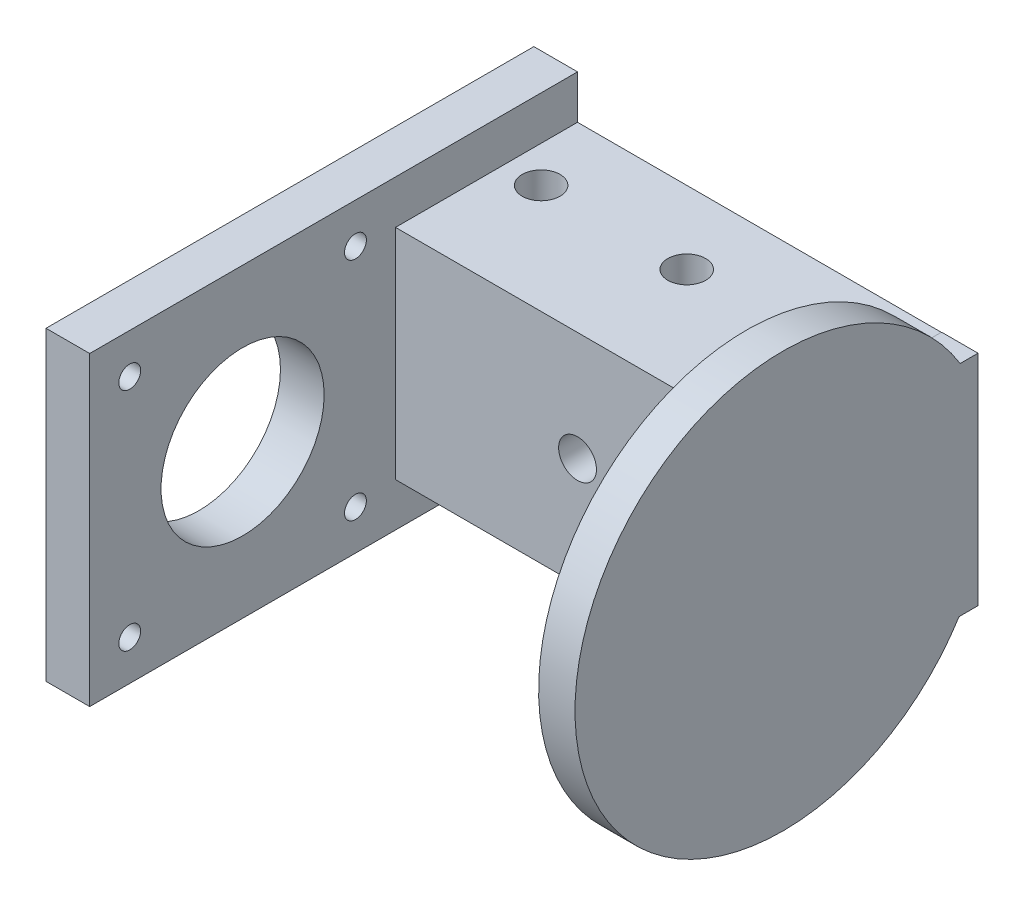
ISO-10303-21;
HEADER;
FILE_DESCRIPTION(('STEP AP214'),'2;1');
FILE_NAME('part.step','',(''),(''),'','','');
FILE_SCHEMA(('AUTOMOTIVE_DESIGN { 1 0 10303 214 1 1 1 1 }'));
ENDSEC;
DATA;
#1=APPLICATION_CONTEXT('core data for automotive mechanical design processes');
#2=APPLICATION_PROTOCOL_DEFINITION('international standard','automotive_design',2000,#1);
#3=PRODUCT_CONTEXT('',#1,'mechanical');
#4=PRODUCT('Part','Part','',(#3));
#5=PRODUCT_RELATED_PRODUCT_CATEGORY('part','',(#4));
#6=PRODUCT_DEFINITION_FORMATION('','',#4);
#7=PRODUCT_DEFINITION_CONTEXT('part definition',#1,'design');
#8=PRODUCT_DEFINITION('design','',#6,#7);
#9=PRODUCT_DEFINITION_SHAPE('','',#8);
#10=(LENGTH_UNIT() NAMED_UNIT(*) SI_UNIT(.MILLI.,.METRE.));
#11=(NAMED_UNIT(*) PLANE_ANGLE_UNIT() SI_UNIT($,.RADIAN.));
#12=(NAMED_UNIT(*) SI_UNIT($,.STERADIAN.) SOLID_ANGLE_UNIT());
#13=UNCERTAINTY_MEASURE_WITH_UNIT(LENGTH_MEASURE(1.E-05),#10,'distance_accuracy_value','');
#14=(GEOMETRIC_REPRESENTATION_CONTEXT(3) GLOBAL_UNCERTAINTY_ASSIGNED_CONTEXT((#13)) GLOBAL_UNIT_ASSIGNED_CONTEXT((#10,
#11,#12)) REPRESENTATION_CONTEXT('',''));
#15=CARTESIAN_POINT('',(0.,0.,0.));
#16=DIRECTION('',(0.,0.,1.));
#17=DIRECTION('',(1.,0.,0.));
#18=AXIS2_PLACEMENT_3D('',#15,#16,#17);
#19=CARTESIAN_POINT('',(39.0280559659004,41.9999994337559,47.0000004470348));
#20=DIRECTION('',(0.,0.,1.));
#21=DIRECTION('',(0.,-1.,0.));
#22=AXIS2_PLACEMENT_3D('',#19,#20,#21);
#23=PLANE('',#22);
#24=DIRECTION('',(0.,-1.,0.));
#25=VECTOR('',#24,1.);
#26=CARTESIAN_POINT('',(45.0280569493771,41.9999994337559,47.0000004470348));
#27=LINE('',#26,#25);
#28=CARTESIAN_POINT('',(45.0280569493771,41.9999994337559,47.0000004470348));
#29=VERTEX_POINT('',#28);
#30=CARTESIAN_POINT('',(45.0280569493771,0.,47.0000004470348));
#31=VERTEX_POINT('',#30);
#32=EDGE_CURVE('E198',#29,#31,#27,.T.);
#33=ORIENTED_EDGE('',*,*,#32,.F.);
#34=DIRECTION('',(1.,0.,0.));
#35=VECTOR('',#34,1.);
#36=CARTESIAN_POINT('',(39.0280559659004,41.9999994337559,47.0000004470348));
#37=LINE('',#36,#35);
#38=CARTESIAN_POINT('',(39.0280559659004,41.9999994337559,47.0000004470348));
#39=VERTEX_POINT('',#38);
#40=EDGE_CURVE('E11',#39,#29,#37,.T.);
#41=ORIENTED_EDGE('',*,*,#40,.F.);
#42=DIRECTION('',(0.,-1.,0.));
#43=VECTOR('',#42,1.);
#44=CARTESIAN_POINT('',(39.0280559659004,41.9999994337559,47.0000004470348));
#45=LINE('',#44,#43);
#46=CARTESIAN_POINT('',(39.0280559659004,0.,47.0000004470348));
#47=VERTEX_POINT('',#46);
#48=EDGE_CURVE('E199',#39,#47,#45,.T.);
#49=ORIENTED_EDGE('',*,*,#48,.T.);
#50=DIRECTION('',(1.,0.,0.));
#51=VECTOR('',#50,1.);
#52=CARTESIAN_POINT('',(39.0280559659004,0.,47.0000004470348));
#53=LINE('',#52,#51);
#54=EDGE_CURVE('E213',#47,#31,#53,.T.);
#55=ORIENTED_EDGE('',*,*,#54,.T.);
#56=EDGE_LOOP('',(#33,#41,#49,#55));
#57=FACE_BOUND('',#56,.T.);
#58=ADVANCED_FACE('F39',(#57),#23,.T.);
#59=CARTESIAN_POINT('',(39.0280559659004,41.9999994337559,-19.9999995529652));
#60=DIRECTION('',(0.,1.,0.));
#61=DIRECTION('',(0.,0.,1.));
#62=AXIS2_PLACEMENT_3D('',#59,#60,#61);
#63=PLANE('',#62);
#64=DIRECTION('',(0.,0.,1.));
#65=VECTOR('',#64,1.);
#66=CARTESIAN_POINT('',(45.0280569493771,41.9999994337559,-19.9999995529652));
#67=LINE('',#66,#65);
#68=CARTESIAN_POINT('',(45.0280569493771,41.9999994337559,-19.9999995529652));
#69=VERTEX_POINT('',#68);
#70=EDGE_CURVE('E203',#69,#29,#67,.T.);
#71=ORIENTED_EDGE('',*,*,#70,.F.);
#72=DIRECTION('',(1.,0.,0.));
#73=VECTOR('',#72,1.);
#74=CARTESIAN_POINT('',(39.0280559659004,41.9999994337559,-19.9999995529652));
#75=LINE('',#74,#73);
#76=CARTESIAN_POINT('',(39.0280559659004,41.9999994337559,-19.9999995529652));
#77=VERTEX_POINT('',#76);
#78=EDGE_CURVE('E47',#77,#69,#75,.T.);
#79=ORIENTED_EDGE('',*,*,#78,.F.);
#80=DIRECTION('',(0.,0.,1.));
#81=VECTOR('',#80,1.);
#82=CARTESIAN_POINT('',(39.0280559659004,41.9999994337559,-19.9999995529652));
#83=LINE('',#82,#81);
#84=EDGE_CURVE('E210',#77,#39,#83,.T.);
#85=ORIENTED_EDGE('',*,*,#84,.T.);
#86=ORIENTED_EDGE('',*,*,#40,.T.);
#87=EDGE_LOOP('',(#71,#79,#85,#86));
#88=FACE_BOUND('',#87,.T.);
#89=ADVANCED_FACE('F297',(#88),#63,.T.);
#90=CARTESIAN_POINT('',(39.0280559659004,0.,-19.9999995529652));
#91=DIRECTION('',(0.,0.,-1.));
#92=DIRECTION('',(0.,1.,0.));
#93=AXIS2_PLACEMENT_3D('',#90,#91,#92);
#94=PLANE('',#93);
#95=DIRECTION('',(-1.,0.,0.));
#96=VECTOR('',#95,1.);
#97=CARTESIAN_POINT('',(95.0280569493771,6.00000005215406,-19.9999995529652));
#98=LINE('',#97,#96);
#99=CARTESIAN_POINT('',(100.028056949377,6.00000005215406,-19.9999995529652));
#100=VERTEX_POINT('',#99);
#101=CARTESIAN_POINT('',(45.0280569493771,6.00000005215406,-19.9999995529652));
#102=VERTEX_POINT('',#101);
#103=EDGE_CURVE('E177',#100,#102,#98,.T.);
#104=ORIENTED_EDGE('',*,*,#103,.T.);
#105=DIRECTION('',(0.,1.,0.));
#106=VECTOR('',#105,1.);
#107=CARTESIAN_POINT('',(45.0280569493771,0.,-19.9999995529652));
#108=LINE('',#107,#106);
#109=CARTESIAN_POINT('',(45.0280569493771,0.,-19.9999995529652));
#110=VERTEX_POINT('',#109);
#111=EDGE_CURVE('E220',#110,#102,#108,.T.);
#112=ORIENTED_EDGE('',*,*,#111,.F.);
#113=DIRECTION('',(1.,0.,0.));
#114=VECTOR('',#113,1.);
#115=CARTESIAN_POINT('',(39.0280559659004,0.,-19.9999995529652));
#116=LINE('',#115,#114);
#117=CARTESIAN_POINT('',(39.0280559659004,0.,-19.9999995529652));
#118=VERTEX_POINT('',#117);
#119=EDGE_CURVE('E227',#118,#110,#116,.T.);
#120=ORIENTED_EDGE('',*,*,#119,.F.);
#121=DIRECTION('',(0.,1.,0.));
#122=VECTOR('',#121,1.);
#123=CARTESIAN_POINT('',(39.0280559659004,0.,-19.9999995529652));
#124=LINE('',#123,#122);
#125=CARTESIAN_POINT('',(39.0280559659004,10.9999999403954,-19.9999995529652));
#126=VERTEX_POINT('',#125);
#127=EDGE_CURVE('E207',#118,#126,#124,.T.);
#128=ORIENTED_EDGE('',*,*,#127,.T.);
#129=DIRECTION('',(-1.,0.,0.));
#130=VECTOR('',#129,1.);
#131=CARTESIAN_POINT('',(95.0280569493771,10.9999999403954,-19.9999995529652));
#132=LINE('',#131,#130);
#133=CARTESIAN_POINT('',(95.0280569493771,10.9999999403954,-19.9999995529652));
#134=VERTEX_POINT('',#133);
#135=EDGE_CURVE('E277',#134,#126,#132,.T.);
#136=ORIENTED_EDGE('',*,*,#135,.F.);
#137=DIRECTION('',(0.,1.,0.));
#138=VECTOR('',#137,1.);
#139=CARTESIAN_POINT('',(95.0280569493771,6.00000005215406,-19.9999995529652));
#140=LINE('',#139,#138);
#141=CARTESIAN_POINT('',(95.0280569493771,30.9999994933605,-19.9999995529652));
#142=VERTEX_POINT('',#141);
#143=EDGE_CURVE('E314',#134,#142,#140,.T.);
#144=ORIENTED_EDGE('',*,*,#143,.T.);
#145=DIRECTION('',(-1.,0.,0.));
#146=VECTOR('',#145,1.);
#147=CARTESIAN_POINT('',(95.0280569493771,30.9999994933605,-19.9999995529652));
#148=LINE('',#147,#146);
#149=CARTESIAN_POINT('',(39.0280559659004,30.9999994933605,-19.9999995529652));
#150=VERTEX_POINT('',#149);
#151=EDGE_CURVE('E266',#142,#150,#148,.T.);
#152=ORIENTED_EDGE('',*,*,#151,.T.);
#153=EDGE_CURVE('E206',#150,#77,#124,.T.);
#154=ORIENTED_EDGE('',*,*,#153,.T.);
#155=ORIENTED_EDGE('',*,*,#78,.T.);
#156=CARTESIAN_POINT('',(45.0280569493771,35.9999984502792,-19.9999995529652));
#157=VERTEX_POINT('',#156);
#158=EDGE_CURVE('E219',#157,#69,#108,.T.);
#159=ORIENTED_EDGE('',*,*,#158,.F.);
#160=DIRECTION('',(-1.,0.,0.));
#161=VECTOR('',#160,1.);
#162=CARTESIAN_POINT('',(95.0280569493771,35.9999984502792,-19.9999995529652));
#163=LINE('',#162,#161);
#164=CARTESIAN_POINT('',(95.0280569493771,35.9999984502792,-19.9999995529652));
#165=VERTEX_POINT('',#164);
#166=EDGE_CURVE('E174',#165,#157,#163,.T.);
#167=ORIENTED_EDGE('',*,*,#166,.F.);
#168=CARTESIAN_POINT('',(95.0280569493771,36.0364722615263,-19.9999995529652));
#169=VERTEX_POINT('',#168);
#170=EDGE_CURVE('E280',#165,#169,#140,.T.);
#171=ORIENTED_EDGE('',*,*,#170,.T.);
#172=DIRECTION('',(1.,0.,0.));
#173=VECTOR('',#172,1.);
#174=CARTESIAN_POINT('',(95.0280569493771,36.0364722615263,-19.9999995529652));
#175=LINE('',#174,#173);
#176=CARTESIAN_POINT('',(100.028056949377,36.0364722615263,-19.9999995529652));
#177=VERTEX_POINT('',#176);
#178=EDGE_CURVE('E311',#169,#177,#175,.T.);
#179=ORIENTED_EDGE('',*,*,#178,.T.);
#180=DIRECTION('',(0.,-1.,0.));
#181=VECTOR('',#180,1.);
#182=CARTESIAN_POINT('',(100.028056949377,6.00000005215406,-19.9999995529652));
#183=LINE('',#182,#181);
#184=EDGE_CURVE('E308',#177,#100,#183,.T.);
#185=ORIENTED_EDGE('',*,*,#184,.T.);
#186=EDGE_LOOP('',(#104,#112,#120,#128,#136,#144,#152,#154,#155,#159,#167,#171,#179,#185));
#187=FACE_BOUND('',#186,.T.);
#188=ADVANCED_FACE('F291',(#187),#94,.T.);
#189=CARTESIAN_POINT('',(39.0280559659004,0.,47.0000004470348));
#190=DIRECTION('',(0.,-1.,0.));
#191=DIRECTION('',(0.,0.,-1.));
#192=AXIS2_PLACEMENT_3D('',#189,#190,#191);
#193=PLANE('',#192);
#194=DIRECTION('',(0.,0.,-1.));
#195=VECTOR('',#194,1.);
#196=CARTESIAN_POINT('',(45.0280569493771,0.,47.0000004470348));
#197=LINE('',#196,#195);
#198=EDGE_CURVE('E216',#31,#110,#197,.T.);
#199=ORIENTED_EDGE('',*,*,#198,.F.);
#200=ORIENTED_EDGE('',*,*,#54,.F.);
#201=DIRECTION('',(0.,0.,-1.));
#202=VECTOR('',#201,1.);
#203=CARTESIAN_POINT('',(39.0280559659004,0.,47.0000004470348));
#204=LINE('',#203,#202);
#205=EDGE_CURVE('E202',#47,#118,#204,.T.);
#206=ORIENTED_EDGE('',*,*,#205,.T.);
#207=ORIENTED_EDGE('',*,*,#119,.T.);
#208=EDGE_LOOP('',(#199,#200,#206,#207));
#209=FACE_BOUND('',#208,.T.);
#210=ADVANCED_FACE('F304',(#209),#193,.T.);
#211=CARTESIAN_POINT('',(39.0280559659004,0.,0.));
#212=DIRECTION('',(1.,0.,0.));
#213=DIRECTION('',(0.,0.,-1.));
#214=AXIS2_PLACEMENT_3D('',#211,#212,#213);
#215=PLANE('',#214);
#216=CARTESIAN_POINT('',(39.0280559659004,36.4999992512167,41.4999998882413));
#217=DIRECTION('',(1.,0.,0.));
#218=DIRECTION('',(0.,0.,-1.));
#219=AXIS2_PLACEMENT_3D('',#216,#217,#218);
#220=CIRCLE('',#219,1.5);
#221=CARTESIAN_POINT('',(39.0280559659004,36.4999992512167,39.9999998882413));
#222=VERTEX_POINT('',#221);
#223=EDGE_CURVE('E342',#222,#222,#220,.T.);
#224=ORIENTED_EDGE('',*,*,#223,.T.);
#225=EDGE_LOOP('',(#224));
#226=FACE_BOUND('',#225,.T.);
#227=CARTESIAN_POINT('',(39.0280559659004,5.49999925121665,41.4999998882413));
#228=DIRECTION('',(1.,0.,0.));
#229=DIRECTION('',(0.,0.,-1.));
#230=AXIS2_PLACEMENT_3D('',#227,#228,#229);
#231=CIRCLE('',#230,1.5);
#232=CARTESIAN_POINT('',(39.0280559659004,5.49999925121665,39.9999998882413));
#233=VERTEX_POINT('',#232);
#234=EDGE_CURVE('E336',#233,#233,#231,.T.);
#235=ORIENTED_EDGE('',*,*,#234,.T.);
#236=EDGE_LOOP('',(#235));
#237=FACE_BOUND('',#236,.T.);
#238=CARTESIAN_POINT('',(39.0280559659004,5.49999925121665,10.4999998882413));
#239=DIRECTION('',(1.,0.,0.));
#240=DIRECTION('',(0.,0.,-1.));
#241=AXIS2_PLACEMENT_3D('',#238,#239,#240);
#242=CIRCLE('',#241,1.5);
#243=CARTESIAN_POINT('',(39.0280559659004,5.49999925121665,8.99999988824129));
#244=VERTEX_POINT('',#243);
#245=EDGE_CURVE('E330',#244,#244,#242,.T.);
#246=ORIENTED_EDGE('',*,*,#245,.T.);
#247=EDGE_LOOP('',(#246));
#248=FACE_BOUND('',#247,.T.);
#249=CARTESIAN_POINT('',(39.0280559659004,36.4999992512167,10.4999998882413));
#250=DIRECTION('',(1.,0.,0.));
#251=DIRECTION('',(0.,0.,-1.));
#252=AXIS2_PLACEMENT_3D('',#249,#250,#251);
#253=CIRCLE('',#252,1.5);
#254=CARTESIAN_POINT('',(39.0280559659004,36.4999992512167,8.99999988824129));
#255=VERTEX_POINT('',#254);
#256=EDGE_CURVE('E345',#255,#255,#253,.T.);
#257=ORIENTED_EDGE('',*,*,#256,.T.);
#258=EDGE_LOOP('',(#257));
#259=FACE_BOUND('',#258,.T.);
#260=CARTESIAN_POINT('',(39.0280559659004,20.9999992512167,25.9999998882413));
#261=DIRECTION('',(1.,0.,0.));
#262=DIRECTION('',(0.,0.,-1.));
#263=AXIS2_PLACEMENT_3D('',#260,#261,#262);
#264=CIRCLE('',#263,11.2);
#265=CARTESIAN_POINT('',(39.0280559659004,20.9999992512167,14.7999998882413));
#266=VERTEX_POINT('',#265);
#267=EDGE_CURVE('E256',#266,#266,#264,.T.);
#268=ORIENTED_EDGE('',*,*,#267,.T.);
#269=EDGE_LOOP('',(#268));
#270=FACE_BOUND('',#269,.T.);
#271=ORIENTED_EDGE('',*,*,#153,.F.);
#272=DIRECTION('',(0.,0.,-1.));
#273=VECTOR('',#272,1.);
#274=CARTESIAN_POINT('',(39.0280559659004,30.9999994933605,0.));
#275=LINE('',#274,#273);
#276=CARTESIAN_POINT('',(39.0280559659004,30.9999994933605,0.));
#277=VERTEX_POINT('',#276);
#278=EDGE_CURVE('E259',#277,#150,#275,.T.);
#279=ORIENTED_EDGE('',*,*,#278,.F.);
#280=DIRECTION('',(0.,1.,0.));
#281=VECTOR('',#280,1.);
#282=CARTESIAN_POINT('',(39.0280559659004,10.9999999403954,0.));
#283=LINE('',#282,#281);
#284=CARTESIAN_POINT('',(39.0280559659004,10.9999999403954,0.));
#285=VERTEX_POINT('',#284);
#286=EDGE_CURVE('E262',#285,#277,#283,.T.);
#287=ORIENTED_EDGE('',*,*,#286,.F.);
#288=DIRECTION('',(0.,0.,1.));
#289=VECTOR('',#288,1.);
#290=CARTESIAN_POINT('',(39.0280559659004,10.9999999403954,-19.9999995529652));
#291=LINE('',#290,#289);
#292=EDGE_CURVE('E269',#126,#285,#291,.T.);
#293=ORIENTED_EDGE('',*,*,#292,.F.);
#294=ORIENTED_EDGE('',*,*,#127,.F.);
#295=ORIENTED_EDGE('',*,*,#205,.F.);
#296=ORIENTED_EDGE('',*,*,#48,.F.);
#297=ORIENTED_EDGE('',*,*,#84,.F.);
#298=EDGE_LOOP('',(#271,#279,#287,#293,#294,#295,#296,#297));
#299=FACE_BOUND('',#298,.T.);
#300=ADVANCED_FACE('F384',(#226,#237,#248,#259,#270,#299),#215,.F.);
#301=CARTESIAN_POINT('',(45.0280569493771,0.,0.));
#302=DIRECTION('',(1.,0.,0.));
#303=DIRECTION('',(0.,0.,-1.));
#304=AXIS2_PLACEMENT_3D('',#301,#302,#303);
#305=PLANE('',#304);
#306=CARTESIAN_POINT('',(45.0280569493771,36.4999992512167,41.4999998882413));
#307=DIRECTION('',(1.,0.,0.));
#308=DIRECTION('',(0.,0.,-1.));
#309=AXIS2_PLACEMENT_3D('',#306,#307,#308);
#310=CIRCLE('',#309,1.5);
#311=CARTESIAN_POINT('',(45.0280569493771,36.4999992512167,39.9999998882413));
#312=VERTEX_POINT('',#311);
#313=EDGE_CURVE('E339',#312,#312,#310,.T.);
#314=ORIENTED_EDGE('',*,*,#313,.F.);
#315=EDGE_LOOP('',(#314));
#316=FACE_BOUND('',#315,.T.);
#317=CARTESIAN_POINT('',(45.0280569493771,5.49999925121665,41.4999998882413));
#318=DIRECTION('',(1.,0.,0.));
#319=DIRECTION('',(0.,0.,-1.));
#320=AXIS2_PLACEMENT_3D('',#317,#318,#319);
#321=CIRCLE('',#320,1.5);
#322=CARTESIAN_POINT('',(45.0280569493771,5.49999925121665,39.9999998882413));
#323=VERTEX_POINT('',#322);
#324=EDGE_CURVE('E333',#323,#323,#321,.T.);
#325=ORIENTED_EDGE('',*,*,#324,.F.);
#326=EDGE_LOOP('',(#325));
#327=FACE_BOUND('',#326,.T.);
#328=CARTESIAN_POINT('',(45.0280569493771,5.49999925121665,10.4999998882413));
#329=DIRECTION('',(1.,0.,0.));
#330=DIRECTION('',(0.,0.,-1.));
#331=AXIS2_PLACEMENT_3D('',#328,#329,#330);
#332=CIRCLE('',#331,1.5);
#333=CARTESIAN_POINT('',(45.0280569493771,5.49999925121665,8.99999988824129));
#334=VERTEX_POINT('',#333);
#335=EDGE_CURVE('E326',#334,#334,#332,.T.);
#336=ORIENTED_EDGE('',*,*,#335,.F.);
#337=EDGE_LOOP('',(#336));
#338=FACE_BOUND('',#337,.T.);
#339=CARTESIAN_POINT('',(45.0280569493771,36.4999992512167,10.4999998882413));
#340=DIRECTION('',(1.,0.,0.));
#341=DIRECTION('',(0.,0.,-1.));
#342=AXIS2_PLACEMENT_3D('',#339,#340,#341);
#343=CIRCLE('',#342,1.5);
#344=CARTESIAN_POINT('',(45.0280569493771,36.4999992512167,8.99999988824129));
#345=VERTEX_POINT('',#344);
#346=EDGE_CURVE('E329',#345,#345,#343,.T.);
#347=ORIENTED_EDGE('',*,*,#346,.F.);
#348=EDGE_LOOP('',(#347));
#349=FACE_BOUND('',#348,.T.);
#350=CARTESIAN_POINT('',(45.0280569493771,20.9999992512167,25.9999998882413));
#351=DIRECTION('',(1.,0.,0.));
#352=DIRECTION('',(0.,0.,-1.));
#353=AXIS2_PLACEMENT_3D('',#350,#351,#352);
#354=CIRCLE('',#353,11.2);
#355=CARTESIAN_POINT('',(45.0280569493771,20.9999992512167,14.7999998882413));
#356=VERTEX_POINT('',#355);
#357=EDGE_CURVE('E253',#356,#356,#354,.T.);
#358=ORIENTED_EDGE('',*,*,#357,.F.);
#359=EDGE_LOOP('',(#358));
#360=FACE_BOUND('',#359,.T.);
#361=DIRECTION('',(0.,0.,1.));
#362=VECTOR('',#361,1.);
#363=CARTESIAN_POINT('',(45.0280569493771,35.9999984502792,4.99999988824129));
#364=LINE('',#363,#362);
#365=CARTESIAN_POINT('',(45.0280569493771,35.9999984502792,4.99999988824129));
#366=VERTEX_POINT('',#365);
#367=EDGE_CURVE('E183',#157,#366,#364,.T.);
#368=ORIENTED_EDGE('',*,*,#367,.F.);
#369=ORIENTED_EDGE('',*,*,#158,.T.);
#370=ORIENTED_EDGE('',*,*,#70,.T.);
#371=ORIENTED_EDGE('',*,*,#32,.T.);
#372=ORIENTED_EDGE('',*,*,#198,.T.);
#373=ORIENTED_EDGE('',*,*,#111,.T.);
#374=DIRECTION('',(0.,0.,-1.));
#375=VECTOR('',#374,1.);
#376=CARTESIAN_POINT('',(45.0280569493771,6.00000005215406,-19.9999995529652));
#377=LINE('',#376,#375);
#378=CARTESIAN_POINT('',(45.0280569493771,6.00000005215406,4.99999988824129));
#379=VERTEX_POINT('',#378);
#380=EDGE_CURVE('E190',#379,#102,#377,.T.);
#381=ORIENTED_EDGE('',*,*,#380,.F.);
#382=DIRECTION('',(0.,-1.,0.));
#383=VECTOR('',#382,1.);
#384=CARTESIAN_POINT('',(45.0280569493771,6.00000005215406,4.99999988824129));
#385=LINE('',#384,#383);
#386=EDGE_CURVE('E186',#366,#379,#385,.T.);
#387=ORIENTED_EDGE('',*,*,#386,.F.);
#388=EDGE_LOOP('',(#368,#369,#370,#371,#372,#373,#381,#387));
#389=FACE_BOUND('',#388,.T.);
#390=ADVANCED_FACE('F289',(#316,#327,#338,#349,#360,#389),#305,.T.);
#391=CARTESIAN_POINT('',(95.0280569493771,35.9999984502792,4.99999988824129));
#392=DIRECTION('',(0.,-1.,0.));
#393=DIRECTION('',(0.,0.,-1.));
#394=AXIS2_PLACEMENT_3D('',#391,#392,#393);
#395=PLANE('',#394);
#396=CARTESIAN_POINT('',(50.0280569493771,35.9999984502792,-9.99999955296516));
#397=DIRECTION('',(0.,-1.,0.));
#398=DIRECTION('',(0.,0.,-1.));
#399=AXIS2_PLACEMENT_3D('',#396,#397,#398);
#400=CIRCLE('',#399,2.6);
#401=CARTESIAN_POINT('',(50.0280569493771,35.9999984502792,-12.5999995529652));
#402=VERTEX_POINT('',#401);
#403=EDGE_CURVE('E241',#402,#402,#400,.T.);
#404=ORIENTED_EDGE('',*,*,#403,.T.);
#405=EDGE_LOOP('',(#404));
#406=FACE_BOUND('',#405,.T.);
#407=CARTESIAN_POINT('',(70.0280569493771,35.9999984502792,-9.99999955296502));
#408=DIRECTION('',(0.,-1.,0.));
#409=DIRECTION('',(0.,0.,-1.));
#410=AXIS2_PLACEMENT_3D('',#407,#408,#409);
#411=CIRCLE('',#410,2.6);
#412=CARTESIAN_POINT('',(70.0280569493771,35.9999984502792,-12.599999552965));
#413=VERTEX_POINT('',#412);
#414=EDGE_CURVE('E237',#413,#413,#411,.T.);
#415=ORIENTED_EDGE('',*,*,#414,.T.);
#416=EDGE_LOOP('',(#415));
#417=FACE_BOUND('',#416,.T.);
#418=ORIENTED_EDGE('',*,*,#367,.T.);
#419=DIRECTION('',(-1.,0.,0.));
#420=VECTOR('',#419,1.);
#421=CARTESIAN_POINT('',(95.0280569493771,35.9999984502792,4.99999988824129));
#422=LINE('',#421,#420);
#423=CARTESIAN_POINT('',(95.0280569493771,35.9999984502792,4.99999988824129));
#424=VERTEX_POINT('',#423);
#425=EDGE_CURVE('E195',#424,#366,#422,.T.);
#426=ORIENTED_EDGE('',*,*,#425,.F.);
#427=DIRECTION('',(0.,0.,1.));
#428=VECTOR('',#427,1.);
#429=CARTESIAN_POINT('',(95.0280569493771,35.9999984502792,4.99999988824129));
#430=LINE('',#429,#428);
#431=EDGE_CURVE('E179',#165,#424,#430,.T.);
#432=ORIENTED_EDGE('',*,*,#431,.F.);
#433=ORIENTED_EDGE('',*,*,#166,.T.);
#434=EDGE_LOOP('',(#418,#426,#432,#433));
#435=FACE_BOUND('',#434,.T.);
#436=ADVANCED_FACE('F286',(#406,#417,#435),#395,.F.);
#437=CARTESIAN_POINT('',(95.0280569493771,6.00000005215406,4.99999988824129));
#438=DIRECTION('',(0.,0.,-1.));
#439=DIRECTION('',(-1.,0.,0.));
#440=AXIS2_PLACEMENT_3D('',#437,#438,#439);
#441=PLANE('',#440);
#442=CARTESIAN_POINT('',(70.0280569493771,20.9999992512167,4.99999988824129));
#443=DIRECTION('',(0.,0.,1.));
#444=DIRECTION('',(1.,0.,0.));
#445=AXIS2_PLACEMENT_3D('',#442,#443,#444);
#446=CIRCLE('',#445,2.6);
#447=CARTESIAN_POINT('',(72.6280569493771,20.9999992512167,4.99999988824129));
#448=VERTEX_POINT('',#447);
#449=EDGE_CURVE('E322',#448,#448,#446,.T.);
#450=ORIENTED_EDGE('',*,*,#449,.F.);
#451=EDGE_LOOP('',(#450));
#452=FACE_BOUND('',#451,.T.);
#453=ORIENTED_EDGE('',*,*,#386,.T.);
#454=DIRECTION('',(-1.,0.,0.));
#455=VECTOR('',#454,1.);
#456=CARTESIAN_POINT('',(95.0280569493771,6.00000005215406,4.99999988824129));
#457=LINE('',#456,#455);
#458=CARTESIAN_POINT('',(95.0280569493771,6.00000005215406,4.99999988824129));
#459=VERTEX_POINT('',#458);
#460=EDGE_CURVE('E193',#459,#379,#457,.T.);
#461=ORIENTED_EDGE('',*,*,#460,.F.);
#462=DIRECTION('',(0.,-1.,0.));
#463=VECTOR('',#462,1.);
#464=CARTESIAN_POINT('',(95.0280569493771,6.00000005215406,4.99999988824129));
#465=LINE('',#464,#463);
#466=EDGE_CURVE('E173',#424,#459,#465,.T.);
#467=ORIENTED_EDGE('',*,*,#466,.F.);
#468=ORIENTED_EDGE('',*,*,#425,.T.);
#469=EDGE_LOOP('',(#453,#461,#467,#468));
#470=FACE_BOUND('',#469,.T.);
#471=ADVANCED_FACE('F285',(#452,#470),#441,.F.);
#472=CARTESIAN_POINT('',(95.0280569493771,6.00000005215406,-19.9999995529652));
#473=DIRECTION('',(0.,1.,0.));
#474=DIRECTION('',(0.,0.,1.));
#475=AXIS2_PLACEMENT_3D('',#472,#473,#474);
#476=PLANE('',#475);
#477=CARTESIAN_POINT('',(50.0280569493771,6.00000005215406,-9.99999955296516));
#478=DIRECTION('',(0.,-1.,0.));
#479=DIRECTION('',(0.,0.,-1.));
#480=AXIS2_PLACEMENT_3D('',#477,#478,#479);
#481=CIRCLE('',#480,2.6);
#482=CARTESIAN_POINT('',(50.0280569493771,6.00000005215406,-12.5999995529652));
#483=VERTEX_POINT('',#482);
#484=EDGE_CURVE('E233',#483,#483,#481,.T.);
#485=ORIENTED_EDGE('',*,*,#484,.F.);
#486=EDGE_LOOP('',(#485));
#487=FACE_BOUND('',#486,.T.);
#488=CARTESIAN_POINT('',(70.0280569493771,6.00000005215406,-9.99999955296502));
#489=DIRECTION('',(0.,-1.,0.));
#490=DIRECTION('',(0.,0.,-1.));
#491=AXIS2_PLACEMENT_3D('',#488,#489,#490);
#492=CIRCLE('',#491,2.6);
#493=CARTESIAN_POINT('',(70.0280569493771,6.00000005215406,-12.599999552965));
#494=VERTEX_POINT('',#493);
#495=EDGE_CURVE('E348',#494,#494,#492,.T.);
#496=ORIENTED_EDGE('',*,*,#495,.F.);
#497=EDGE_LOOP('',(#496));
#498=FACE_BOUND('',#497,.T.);
#499=ORIENTED_EDGE('',*,*,#380,.T.);
#500=ORIENTED_EDGE('',*,*,#103,.F.);
#501=DIRECTION('',(0.,0.,-1.));
#502=VECTOR('',#501,1.);
#503=CARTESIAN_POINT('',(100.028056949377,6.00000005215406,47.0020004470348));
#504=LINE('',#503,#502);
#505=CARTESIAN_POINT('',(100.028056949377,6.00000005215406,-17.3945842221373));
#506=VERTEX_POINT('',#505);
#507=EDGE_CURVE('E158',#506,#100,#504,.T.);
#508=ORIENTED_EDGE('',*,*,#507,.F.);
#509=DIRECTION('',(-1.,0.,0.));
#510=VECTOR('',#509,1.);
#511=CARTESIAN_POINT('',(100.028056949377,6.00000005215406,-17.3945842221373));
#512=LINE('',#511,#510);
#513=CARTESIAN_POINT('',(95.0280569493771,6.00000005215406,-17.3945842221373));
#514=VERTEX_POINT('',#513);
#515=EDGE_CURVE('E148',#506,#514,#512,.T.);
#516=ORIENTED_EDGE('',*,*,#515,.T.);
#517=DIRECTION('',(0.,0.,-1.));
#518=VECTOR('',#517,1.);
#519=CARTESIAN_POINT('',(95.0280569493771,6.00000005215406,-19.9999995529652));
#520=LINE('',#519,#518);
#521=EDGE_CURVE('E154',#459,#514,#520,.T.);
#522=ORIENTED_EDGE('',*,*,#521,.F.);
#523=ORIENTED_EDGE('',*,*,#460,.T.);
#524=EDGE_LOOP('',(#499,#500,#508,#516,#522,#523));
#525=FACE_BOUND('',#524,.T.);
#526=ADVANCED_FACE('F151',(#487,#498,#525),#476,.F.);
#527=CARTESIAN_POINT('',(95.0280569493771,30.9999994933605,0.));
#528=DIRECTION('',(0.,1.,0.));
#529=DIRECTION('',(0.,0.,1.));
#530=AXIS2_PLACEMENT_3D('',#527,#528,#529);
#531=PLANE('',#530);
#532=CARTESIAN_POINT('',(50.0280569493771,30.9999994933605,-9.99999955296516));
#533=DIRECTION('',(0.,1.,0.));
#534=DIRECTION('',(0.,0.,1.));
#535=AXIS2_PLACEMENT_3D('',#532,#533,#534);
#536=CIRCLE('',#535,2.6);
#537=CARTESIAN_POINT('',(50.0280569493771,30.9999994933605,-7.39999955296517));
#538=VERTEX_POINT('',#537);
#539=EDGE_CURVE('E236',#538,#538,#536,.T.);
#540=ORIENTED_EDGE('',*,*,#539,.T.);
#541=EDGE_LOOP('',(#540));
#542=FACE_BOUND('',#541,.T.);
#543=CARTESIAN_POINT('',(70.0280569493771,30.9999994933605,-9.99999955296502));
#544=DIRECTION('',(0.,1.,0.));
#545=DIRECTION('',(0.,0.,1.));
#546=AXIS2_PLACEMENT_3D('',#543,#544,#545);
#547=CIRCLE('',#546,2.6);
#548=CARTESIAN_POINT('',(70.0280569493771,30.9999994933605,-7.39999955296502));
#549=VERTEX_POINT('',#548);
#550=EDGE_CURVE('E232',#549,#549,#547,.T.);
#551=ORIENTED_EDGE('',*,*,#550,.T.);
#552=EDGE_LOOP('',(#551));
#553=FACE_BOUND('',#552,.T.);
#554=ORIENTED_EDGE('',*,*,#278,.T.);
#555=ORIENTED_EDGE('',*,*,#151,.F.);
#556=DIRECTION('',(0.,0.,-1.));
#557=VECTOR('',#556,1.);
#558=CARTESIAN_POINT('',(95.0280569493771,30.9999994933605,0.));
#559=LINE('',#558,#557);
#560=CARTESIAN_POINT('',(95.0280569493771,30.9999994933605,0.));
#561=VERTEX_POINT('',#560);
#562=EDGE_CURVE('E260',#561,#142,#559,.T.);
#563=ORIENTED_EDGE('',*,*,#562,.F.);
#564=DIRECTION('',(-1.,0.,0.));
#565=VECTOR('',#564,1.);
#566=CARTESIAN_POINT('',(95.0280569493771,30.9999994933605,0.));
#567=LINE('',#566,#565);
#568=EDGE_CURVE('E187',#561,#277,#567,.T.);
#569=ORIENTED_EDGE('',*,*,#568,.T.);
#570=EDGE_LOOP('',(#554,#555,#563,#569));
#571=FACE_BOUND('',#570,.T.);
#572=ADVANCED_FACE('F359',(#542,#553,#571),#531,.F.);
#573=CARTESIAN_POINT('',(95.0280569493771,10.9999999403954,0.));
#574=DIRECTION('',(0.,0.,1.));
#575=DIRECTION('',(0.,-1.,0.));
#576=AXIS2_PLACEMENT_3D('',#573,#574,#575);
#577=PLANE('',#576);
#578=CARTESIAN_POINT('',(70.0280569493771,20.9999992512167,0.));
#579=DIRECTION('',(0.,0.,1.));
#580=DIRECTION('',(0.,-1.,0.));
#581=AXIS2_PLACEMENT_3D('',#578,#579,#580);
#582=CIRCLE('',#581,2.6);
#583=CARTESIAN_POINT('',(70.0280569493771,18.3999992512167,0.));
#584=VERTEX_POINT('',#583);
#585=EDGE_CURVE('E42',#584,#584,#582,.T.);
#586=ORIENTED_EDGE('',*,*,#585,.T.);
#587=EDGE_LOOP('',(#586));
#588=FACE_BOUND('',#587,.T.);
#589=ORIENTED_EDGE('',*,*,#286,.T.);
#590=ORIENTED_EDGE('',*,*,#568,.F.);
#591=DIRECTION('',(0.,1.,0.));
#592=VECTOR('',#591,1.);
#593=CARTESIAN_POINT('',(95.0280569493771,10.9999999403954,0.));
#594=LINE('',#593,#592);
#595=CARTESIAN_POINT('',(95.0280569493771,10.9999999403954,0.));
#596=VERTEX_POINT('',#595);
#597=EDGE_CURVE('E264',#596,#561,#594,.T.);
#598=ORIENTED_EDGE('',*,*,#597,.F.);
#599=DIRECTION('',(-1.,0.,0.));
#600=VECTOR('',#599,1.);
#601=CARTESIAN_POINT('',(95.0280569493771,10.9999999403954,0.));
#602=LINE('',#601,#600);
#603=EDGE_CURVE('E275',#596,#285,#602,.T.);
#604=ORIENTED_EDGE('',*,*,#603,.T.);
#605=EDGE_LOOP('',(#589,#590,#598,#604));
#606=FACE_BOUND('',#605,.T.);
#607=ADVANCED_FACE('F366',(#588,#606),#577,.F.);
#608=CARTESIAN_POINT('',(95.0280569493771,10.9999999403954,-19.9999995529652));
#609=DIRECTION('',(0.,-1.,0.));
#610=DIRECTION('',(0.,0.,-1.));
#611=AXIS2_PLACEMENT_3D('',#608,#609,#610);
#612=PLANE('',#611);
#613=CARTESIAN_POINT('',(50.0280569493771,10.9999999403954,-9.99999955296516));
#614=DIRECTION('',(0.,-1.,0.));
#615=DIRECTION('',(0.,0.,-1.));
#616=AXIS2_PLACEMENT_3D('',#613,#614,#615);
#617=CIRCLE('',#616,2.6);
#618=CARTESIAN_POINT('',(50.0280569493771,10.9999999403954,-12.5999995529652));
#619=VERTEX_POINT('',#618);
#620=EDGE_CURVE('E234',#619,#619,#617,.T.);
#621=ORIENTED_EDGE('',*,*,#620,.T.);
#622=EDGE_LOOP('',(#621));
#623=FACE_BOUND('',#622,.T.);
#624=CARTESIAN_POINT('',(70.0280569493771,10.9999999403954,-9.99999955296502));
#625=DIRECTION('',(0.,-1.,0.));
#626=DIRECTION('',(0.,0.,-1.));
#627=AXIS2_PLACEMENT_3D('',#624,#625,#626);
#628=CIRCLE('',#627,2.6);
#629=CARTESIAN_POINT('',(70.0280569493771,10.9999999403954,-12.599999552965));
#630=VERTEX_POINT('',#629);
#631=EDGE_CURVE('E230',#630,#630,#628,.T.);
#632=ORIENTED_EDGE('',*,*,#631,.T.);
#633=EDGE_LOOP('',(#632));
#634=FACE_BOUND('',#633,.T.);
#635=ORIENTED_EDGE('',*,*,#292,.T.);
#636=ORIENTED_EDGE('',*,*,#603,.F.);
#637=DIRECTION('',(0.,0.,1.));
#638=VECTOR('',#637,1.);
#639=CARTESIAN_POINT('',(95.0280569493771,10.9999999403954,-19.9999995529652));
#640=LINE('',#639,#638);
#641=EDGE_CURVE('E63',#134,#596,#640,.T.);
#642=ORIENTED_EDGE('',*,*,#641,.F.);
#643=ORIENTED_EDGE('',*,*,#135,.T.);
#644=EDGE_LOOP('',(#635,#636,#642,#643));
#645=FACE_BOUND('',#644,.T.);
#646=ADVANCED_FACE('F428',(#623,#634,#645),#612,.F.);
#647=CARTESIAN_POINT('',(35.0280569493771,20.9999992512167,25.9999998882413));
#648=DIRECTION('',(1.,0.,0.));
#649=DIRECTION('',(0.,0.,-1.));
#650=AXIS2_PLACEMENT_3D('',#647,#648,#649);
#651=CYLINDRICAL_SURFACE('',#650,11.2);
#652=ORIENTED_EDGE('',*,*,#357,.T.);
#653=EDGE_LOOP('',(#652));
#654=FACE_BOUND('',#653,.T.);
#655=ORIENTED_EDGE('',*,*,#267,.F.);
#656=EDGE_LOOP('',(#655));
#657=FACE_BOUND('',#656,.T.);
#658=ADVANCED_FACE('F423',(#654,#657),#651,.F.);
#659=CARTESIAN_POINT('',(70.0280569493771,41.9999994337559,-9.99999955296502));
#660=DIRECTION('',(0.,-1.,0.));
#661=DIRECTION('',(0.,0.,-1.));
#662=AXIS2_PLACEMENT_3D('',#659,#660,#661);
#663=CYLINDRICAL_SURFACE('',#662,2.6);
#664=ORIENTED_EDGE('',*,*,#495,.T.);
#665=EDGE_LOOP('',(#664));
#666=FACE_BOUND('',#665,.T.);
#667=ORIENTED_EDGE('',*,*,#631,.F.);
#668=EDGE_LOOP('',(#667));
#669=FACE_BOUND('',#668,.T.);
#670=ADVANCED_FACE('F355',(#666,#669),#663,.F.);
#671=CARTESIAN_POINT('',(50.0280569493771,41.9999994337559,-9.99999955296516));
#672=DIRECTION('',(0.,-1.,0.));
#673=DIRECTION('',(0.,0.,-1.));
#674=AXIS2_PLACEMENT_3D('',#671,#672,#673);
#675=CYLINDRICAL_SURFACE('',#674,2.6);
#676=ORIENTED_EDGE('',*,*,#484,.T.);
#677=EDGE_LOOP('',(#676));
#678=FACE_BOUND('',#677,.T.);
#679=ORIENTED_EDGE('',*,*,#620,.F.);
#680=EDGE_LOOP('',(#679));
#681=FACE_BOUND('',#680,.T.);
#682=ADVANCED_FACE('F407',(#678,#681),#675,.F.);
#683=ORIENTED_EDGE('',*,*,#550,.F.);
#684=EDGE_LOOP('',(#683));
#685=FACE_BOUND('',#684,.T.);
#686=ORIENTED_EDGE('',*,*,#414,.F.);
#687=EDGE_LOOP('',(#686));
#688=FACE_BOUND('',#687,.T.);
#689=ADVANCED_FACE('F404',(#685,#688),#663,.F.);
#690=ORIENTED_EDGE('',*,*,#539,.F.);
#691=EDGE_LOOP('',(#690));
#692=FACE_BOUND('',#691,.T.);
#693=ORIENTED_EDGE('',*,*,#403,.F.);
#694=EDGE_LOOP('',(#693));
#695=FACE_BOUND('',#694,.T.);
#696=ADVANCED_FACE('F401',(#692,#695),#675,.F.);
#697=CARTESIAN_POINT('',(39.0280559659004,36.4999992512167,10.4999998882413));
#698=DIRECTION('',(1.,0.,0.));
#699=DIRECTION('',(0.,0.,-1.));
#700=AXIS2_PLACEMENT_3D('',#697,#698,#699);
#701=CYLINDRICAL_SURFACE('',#700,1.5);
#702=ORIENTED_EDGE('',*,*,#256,.F.);
#703=EDGE_LOOP('',(#702));
#704=FACE_BOUND('',#703,.T.);
#705=ORIENTED_EDGE('',*,*,#346,.T.);
#706=EDGE_LOOP('',(#705));
#707=FACE_BOUND('',#706,.T.);
#708=ADVANCED_FACE('F403',(#704,#707),#701,.F.);
#709=CARTESIAN_POINT('',(39.0280559659004,5.49999925121665,10.4999998882413));
#710=DIRECTION('',(1.,0.,0.));
#711=DIRECTION('',(0.,0.,-1.));
#712=AXIS2_PLACEMENT_3D('',#709,#710,#711);
#713=CYLINDRICAL_SURFACE('',#712,1.5);
#714=ORIENTED_EDGE('',*,*,#245,.F.);
#715=EDGE_LOOP('',(#714));
#716=FACE_BOUND('',#715,.T.);
#717=ORIENTED_EDGE('',*,*,#335,.T.);
#718=EDGE_LOOP('',(#717));
#719=FACE_BOUND('',#718,.T.);
#720=ADVANCED_FACE('F412',(#716,#719),#713,.F.);
#721=CARTESIAN_POINT('',(39.0280559659004,5.49999925121665,41.4999998882413));
#722=DIRECTION('',(1.,0.,0.));
#723=DIRECTION('',(0.,0.,-1.));
#724=AXIS2_PLACEMENT_3D('',#721,#722,#723);
#725=CYLINDRICAL_SURFACE('',#724,1.5);
#726=ORIENTED_EDGE('',*,*,#234,.F.);
#727=EDGE_LOOP('',(#726));
#728=FACE_BOUND('',#727,.T.);
#729=ORIENTED_EDGE('',*,*,#324,.T.);
#730=EDGE_LOOP('',(#729));
#731=FACE_BOUND('',#730,.T.);
#732=ADVANCED_FACE('F469',(#728,#731),#725,.F.);
#733=CARTESIAN_POINT('',(39.0280559659004,36.4999992512167,41.4999998882413));
#734=DIRECTION('',(1.,0.,0.));
#735=DIRECTION('',(0.,0.,-1.));
#736=AXIS2_PLACEMENT_3D('',#733,#734,#735);
#737=CYLINDRICAL_SURFACE('',#736,1.5);
#738=ORIENTED_EDGE('',*,*,#223,.F.);
#739=EDGE_LOOP('',(#738));
#740=FACE_BOUND('',#739,.T.);
#741=ORIENTED_EDGE('',*,*,#313,.T.);
#742=EDGE_LOOP('',(#741));
#743=FACE_BOUND('',#742,.T.);
#744=ADVANCED_FACE('F465',(#740,#743),#737,.F.);
#745=CARTESIAN_POINT('',(70.0280569493771,20.9999992512167,-19.9999995529652));
#746=DIRECTION('',(0.,0.,1.));
#747=DIRECTION('',(1.,0.,0.));
#748=AXIS2_PLACEMENT_3D('',#745,#746,#747);
#749=CYLINDRICAL_SURFACE('',#748,2.6);
#750=ORIENTED_EDGE('',*,*,#449,.T.);
#751=EDGE_LOOP('',(#750));
#752=FACE_BOUND('',#751,.T.);
#753=ORIENTED_EDGE('',*,*,#585,.F.);
#754=EDGE_LOOP('',(#753));
#755=FACE_BOUND('',#754,.T.);
#756=ADVANCED_FACE('F459',(#752,#755),#749,.F.);
#757=CARTESIAN_POINT('',(95.0280569493771,21.1402691534968,6.80213484849464));
#758=DIRECTION('',(1.,0.,0.));
#759=DIRECTION('',(0.,0.,-1.));
#760=AXIS2_PLACEMENT_3D('',#757,#758,#759);
#761=PLANE('',#760);
#762=CARTESIAN_POINT('',(95.0280569493771,21.1402691534968,6.80213484849464));
#763=DIRECTION('',(1.,0.,0.));
#764=DIRECTION('',(0.,0.,-1.));
#765=AXIS2_PLACEMENT_3D('',#762,#763,#764);
#766=CIRCLE('',#765,28.5431070881247);
#767=CARTESIAN_POINT('',(95.0280569493771,36.0364722615263,-17.5455980071222));
#768=VERTEX_POINT('',#767);
#769=EDGE_CURVE('E164',#768,#514,#766,.T.);
#770=ORIENTED_EDGE('',*,*,#769,.F.);
#771=DIRECTION('',(0.,0.,-1.));
#772=VECTOR('',#771,1.);
#773=CARTESIAN_POINT('',(95.0280569493771,36.0364722615263,47.0020004470348));
#774=LINE('',#773,#772);
#775=EDGE_CURVE('E319',#768,#169,#774,.T.);
#776=ORIENTED_EDGE('',*,*,#775,.T.);
#777=ORIENTED_EDGE('',*,*,#170,.F.);
#778=ORIENTED_EDGE('',*,*,#431,.T.);
#779=ORIENTED_EDGE('',*,*,#466,.T.);
#780=ORIENTED_EDGE('',*,*,#521,.T.);
#781=EDGE_LOOP('',(#770,#776,#777,#778,#779,#780));
#782=FACE_BOUND('',#781,.T.);
#783=ADVANCED_FACE('F171',(#782),#761,.F.);
#784=ORIENTED_EDGE('',*,*,#143,.F.);
#785=ORIENTED_EDGE('',*,*,#641,.T.);
#786=ORIENTED_EDGE('',*,*,#597,.T.);
#787=ORIENTED_EDGE('',*,*,#562,.T.);
#788=EDGE_LOOP('',(#784,#785,#786,#787));
#789=FACE_BOUND('',#788,.T.);
#790=ADVANCED_FACE('F449',(#789),#761,.F.);
#791=CARTESIAN_POINT('',(100.028056949377,21.1402691534968,6.80213484849464));
#792=DIRECTION('',(-1.,0.,0.));
#793=DIRECTION('',(0.,0.,1.));
#794=AXIS2_PLACEMENT_3D('',#791,#792,#793);
#795=CYLINDRICAL_SURFACE('',#794,28.5431070881247);
#796=ORIENTED_EDGE('',*,*,#769,.T.);
#797=ORIENTED_EDGE('',*,*,#515,.F.);
#798=CARTESIAN_POINT('',(100.028056949377,21.1402691534968,6.80213484849464));
#799=DIRECTION('',(1.,0.,0.));
#800=DIRECTION('',(0.,0.,-1.));
#801=AXIS2_PLACEMENT_3D('',#798,#799,#800);
#802=CIRCLE('',#801,28.5431070881247);
#803=CARTESIAN_POINT('',(100.028056949377,36.0364722615263,-17.5455980071222));
#804=VERTEX_POINT('',#803);
#805=EDGE_CURVE('E169',#804,#506,#802,.T.);
#806=ORIENTED_EDGE('',*,*,#805,.F.);
#807=DIRECTION('',(-1.,0.,0.));
#808=VECTOR('',#807,1.);
#809=CARTESIAN_POINT('',(100.028056949377,36.0364722615263,-17.5455980071222));
#810=LINE('',#809,#808);
#811=EDGE_CURVE('E166',#768,#804,#810,.F.);
#812=ORIENTED_EDGE('',*,*,#811,.F.);
#813=EDGE_LOOP('',(#796,#797,#806,#812));
#814=FACE_BOUND('',#813,.T.);
#815=ADVANCED_FACE('F165',(#814),#795,.T.);
#816=CARTESIAN_POINT('',(100.028056949377,21.1402691534968,6.80213484849464));
#817=DIRECTION('',(1.,0.,0.));
#818=DIRECTION('',(0.,0.,-1.));
#819=AXIS2_PLACEMENT_3D('',#816,#817,#818);
#820=PLANE('',#819);
#821=ORIENTED_EDGE('',*,*,#507,.T.);
#822=ORIENTED_EDGE('',*,*,#184,.F.);
#823=DIRECTION('',(0.,0.,-1.));
#824=VECTOR('',#823,1.);
#825=CARTESIAN_POINT('',(100.028056949377,36.0364722615263,47.0020004470348));
#826=LINE('',#825,#824);
#827=EDGE_CURVE('E55',#804,#177,#826,.T.);
#828=ORIENTED_EDGE('',*,*,#827,.F.);
#829=ORIENTED_EDGE('',*,*,#805,.T.);
#830=EDGE_LOOP('',(#821,#822,#828,#829));
#831=FACE_BOUND('',#830,.T.);
#832=ADVANCED_FACE('F307',(#831),#820,.T.);
#833=CARTESIAN_POINT('',(95.0280569493771,36.0364722615263,47.0020004470348));
#834=DIRECTION('',(0.,1.,0.));
#835=DIRECTION('',(0.,0.,1.));
#836=AXIS2_PLACEMENT_3D('',#833,#834,#835);
#837=PLANE('',#836);
#838=ORIENTED_EDGE('',*,*,#775,.F.);
#839=ORIENTED_EDGE('',*,*,#811,.T.);
#840=ORIENTED_EDGE('',*,*,#827,.T.);
#841=ORIENTED_EDGE('',*,*,#178,.F.);
#842=EDGE_LOOP('',(#838,#839,#840,#841));
#843=FACE_BOUND('',#842,.T.);
#844=ADVANCED_FACE('F527',(#843),#837,.T.);
#845=CLOSED_SHELL('',(#58,#89,#188,#210,#300,#390,#436,#471,#526,#572,#607,#646,#658,#670,#682,
#689,#696,#708,#720,#732,#744,#756,#783,#790,#815,#832,#844));
#846=MANIFOLD_SOLID_BREP('B2',#845);
#847=ADVANCED_BREP_SHAPE_REPRESENTATION('',(#18,#846),#14);
#848=SHAPE_DEFINITION_REPRESENTATION(#9,#847);
ENDSEC;
END-ISO-10303-21;
